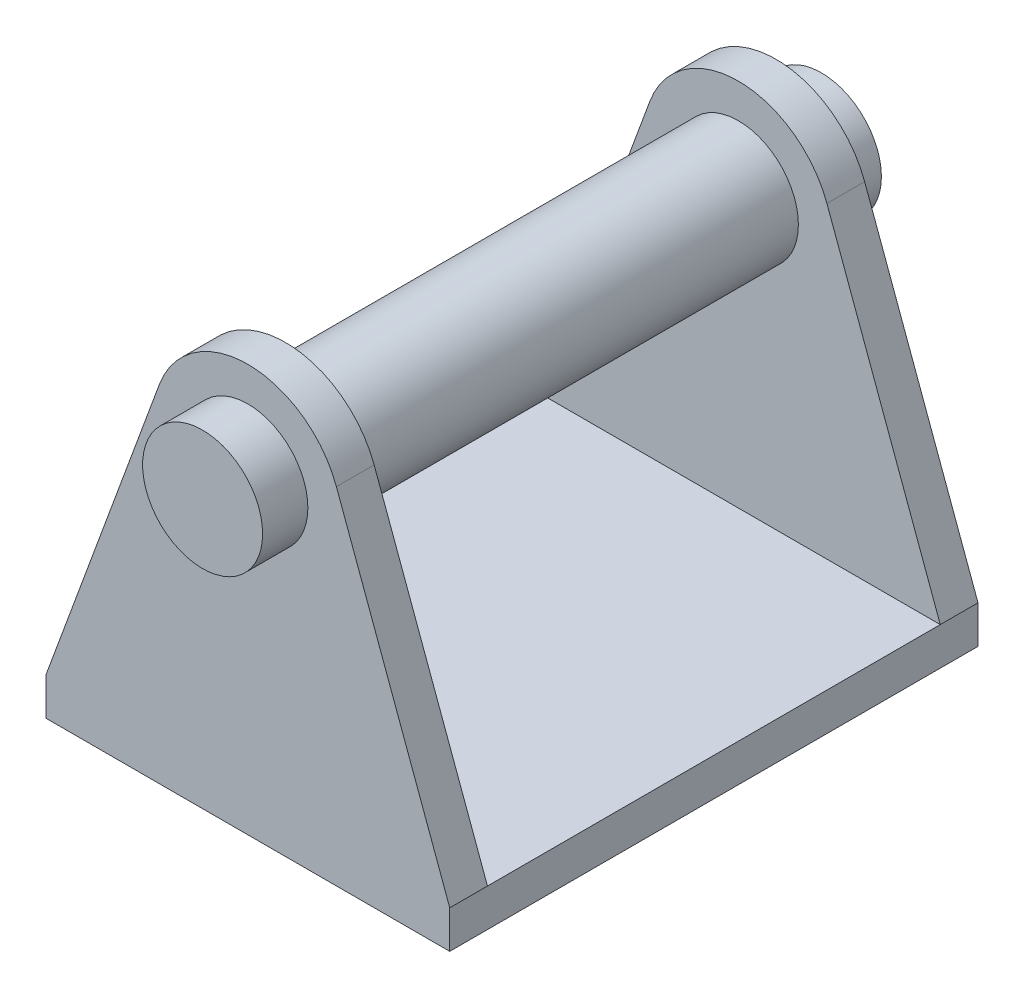
ISO-10303-21;
HEADER;
FILE_DESCRIPTION(('STEP AP214'),'2;1');
FILE_NAME('part.step','',(''),(''),'','','');
FILE_SCHEMA(('AUTOMOTIVE_DESIGN { 1 0 10303 214 1 1 1 1 }'));
ENDSEC;
DATA;
#1=APPLICATION_CONTEXT('core data for automotive mechanical design processes');
#2=APPLICATION_PROTOCOL_DEFINITION('international standard','automotive_design',2000,#1);
#3=PRODUCT_CONTEXT('',#1,'mechanical');
#4=PRODUCT('Part','Part','',(#3));
#5=PRODUCT_RELATED_PRODUCT_CATEGORY('part','',(#4));
#6=PRODUCT_DEFINITION_FORMATION('','',#4);
#7=PRODUCT_DEFINITION_CONTEXT('part definition',#1,'design');
#8=PRODUCT_DEFINITION('design','',#6,#7);
#9=PRODUCT_DEFINITION_SHAPE('','',#8);
#10=(LENGTH_UNIT() NAMED_UNIT(*) SI_UNIT(.MILLI.,.METRE.));
#11=(NAMED_UNIT(*) PLANE_ANGLE_UNIT() SI_UNIT($,.RADIAN.));
#12=(NAMED_UNIT(*) SI_UNIT($,.STERADIAN.) SOLID_ANGLE_UNIT());
#13=UNCERTAINTY_MEASURE_WITH_UNIT(LENGTH_MEASURE(1.E-05),#10,'distance_accuracy_value','');
#14=(GEOMETRIC_REPRESENTATION_CONTEXT(3) GLOBAL_UNCERTAINTY_ASSIGNED_CONTEXT((#13)) GLOBAL_UNIT_ASSIGNED_CONTEXT((#10,
#11,#12)) REPRESENTATION_CONTEXT('',''));
#15=CARTESIAN_POINT('',(0.,0.,0.));
#16=DIRECTION('',(0.,0.,1.));
#17=DIRECTION('',(1.,0.,0.));
#18=AXIS2_PLACEMENT_3D('',#15,#16,#17);
#19=CARTESIAN_POINT('',(0.,73.,-152.));
#20=DIRECTION('',(0.,0.,1.));
#21=DIRECTION('',(1.,0.,0.));
#22=AXIS2_PLACEMENT_3D('',#19,#20,#21);
#23=CYLINDRICAL_SURFACE('',#22,15.9);
#24=CARTESIAN_POINT('',(0.,73.,-130.));
#25=DIRECTION('',(0.,0.,1.));
#26=DIRECTION('',(1.,0.,0.));
#27=AXIS2_PLACEMENT_3D('',#24,#25,#26);
#28=CIRCLE('',#27,15.9);
#29=CARTESIAN_POINT('',(15.9,73.,-130.));
#30=VERTEX_POINT('',#29);
#31=EDGE_CURVE('E11',#30,#30,#28,.F.);
#32=ORIENTED_EDGE('',*,*,#31,.F.);
#33=EDGE_LOOP('',(#32));
#34=FACE_BOUND('',#33,.T.);
#35=CARTESIAN_POINT('',(0.,73.,-10.));
#36=DIRECTION('',(0.,0.,1.));
#37=DIRECTION('',(1.,0.,0.));
#38=AXIS2_PLACEMENT_3D('',#35,#36,#37);
#39=CIRCLE('',#38,15.9);
#40=CARTESIAN_POINT('',(15.9,73.,-10.));
#41=VERTEX_POINT('',#40);
#42=EDGE_CURVE('E97',#41,#41,#39,.T.);
#43=ORIENTED_EDGE('',*,*,#42,.F.);
#44=EDGE_LOOP('',(#43));
#45=FACE_BOUND('',#44,.T.);
#46=ADVANCED_FACE('F36',(#34,#45),#23,.T.);
#47=CARTESIAN_POINT('',(-53.5,0.,-10.));
#48=DIRECTION('',(-0.938482668646884,0.345326339350799,0.));
#49=DIRECTION('',(-0.345326339350799,-0.938482668646884,0.));
#50=AXIS2_PLACEMENT_3D('',#47,#48,#49);
#51=PLANE('',#50);
#52=DIRECTION('',(-0.345326339350799,-0.938482668646884,0.));
#53=VECTOR('',#52,1.);
#54=CARTESIAN_POINT('',(-53.5,0.,0.));
#55=LINE('',#54,#53);
#56=CARTESIAN_POINT('',(-23.4620667161721,81.6331584837699,0.));
#57=VERTEX_POINT('',#56);
#58=CARTESIAN_POINT('',(-53.5,0.,0.));
#59=VERTEX_POINT('',#58);
#60=EDGE_CURVE('E89',#57,#59,#55,.T.);
#61=ORIENTED_EDGE('',*,*,#60,.F.);
#62=DIRECTION('',(0.,0.,1.));
#63=VECTOR('',#62,1.);
#64=CARTESIAN_POINT('',(-23.4620667161721,81.6331584837699,-10.));
#65=LINE('',#64,#63);
#66=CARTESIAN_POINT('',(-23.4620667161721,81.6331584837699,-10.));
#67=VERTEX_POINT('',#66);
#68=EDGE_CURVE('E53',#67,#57,#65,.T.);
#69=ORIENTED_EDGE('',*,*,#68,.F.);
#70=DIRECTION('',(-0.345326339350799,-0.938482668646884,0.));
#71=VECTOR('',#70,1.);
#72=CARTESIAN_POINT('',(-53.5,0.,-10.));
#73=LINE('',#72,#71);
#74=CARTESIAN_POINT('',(-53.5,0.,-10.));
#75=VERTEX_POINT('',#74);
#76=EDGE_CURVE('E102',#67,#75,#73,.T.);
#77=ORIENTED_EDGE('',*,*,#76,.T.);
#78=DIRECTION('',(0.,0.,1.));
#79=VECTOR('',#78,1.);
#80=CARTESIAN_POINT('',(-53.5,0.,-10.));
#81=LINE('',#80,#79);
#82=EDGE_CURVE('E92',#75,#59,#81,.T.);
#83=ORIENTED_EDGE('',*,*,#82,.T.);
#84=EDGE_LOOP('',(#61,#69,#77,#83));
#85=FACE_BOUND('',#84,.T.);
#86=ADVANCED_FACE('F90',(#85),#51,.T.);
#87=CARTESIAN_POINT('',(0.,73.,-10.));
#88=DIRECTION('',(0.,0.,1.));
#89=DIRECTION('',(1.,0.,0.));
#90=AXIS2_PLACEMENT_3D('',#87,#88,#89);
#91=CYLINDRICAL_SURFACE('',#90,25.);
#92=CARTESIAN_POINT('',(0.,73.,0.));
#93=DIRECTION('',(0.,0.,1.));
#94=DIRECTION('',(1.,0.,0.));
#95=AXIS2_PLACEMENT_3D('',#92,#93,#94);
#96=CIRCLE('',#95,25.);
#97=CARTESIAN_POINT('',(23.4620667161721,81.6331584837699,0.));
#98=VERTEX_POINT('',#97);
#99=EDGE_CURVE('E83',#98,#57,#96,.T.);
#100=ORIENTED_EDGE('',*,*,#99,.F.);
#101=DIRECTION('',(0.,0.,1.));
#102=VECTOR('',#101,1.);
#103=CARTESIAN_POINT('',(23.4620667161721,81.6331584837699,-10.));
#104=LINE('',#103,#102);
#105=CARTESIAN_POINT('',(23.4620667161721,81.6331584837699,-10.));
#106=VERTEX_POINT('',#105);
#107=EDGE_CURVE('E76',#106,#98,#104,.T.);
#108=ORIENTED_EDGE('',*,*,#107,.F.);
#109=CARTESIAN_POINT('',(0.,73.,-10.));
#110=DIRECTION('',(0.,0.,1.));
#111=DIRECTION('',(1.,0.,0.));
#112=AXIS2_PLACEMENT_3D('',#109,#110,#111);
#113=CIRCLE('',#112,25.);
#114=EDGE_CURVE('E85',#106,#67,#113,.T.);
#115=ORIENTED_EDGE('',*,*,#114,.T.);
#116=ORIENTED_EDGE('',*,*,#68,.T.);
#117=EDGE_LOOP('',(#100,#108,#115,#116));
#118=FACE_BOUND('',#117,.T.);
#119=ADVANCED_FACE('F81',(#118),#91,.T.);
#120=CARTESIAN_POINT('',(53.5,0.,-10.));
#121=DIRECTION('',(0.938482668646884,0.345326339350799,0.));
#122=DIRECTION('',(-0.345326339350799,0.938482668646884,0.));
#123=AXIS2_PLACEMENT_3D('',#120,#121,#122);
#124=PLANE('',#123);
#125=DIRECTION('',(-0.345326339350799,0.938482668646884,0.));
#126=VECTOR('',#125,1.);
#127=CARTESIAN_POINT('',(53.5,0.,0.));
#128=LINE('',#127,#126);
#129=CARTESIAN_POINT('',(53.5,0.,0.));
#130=VERTEX_POINT('',#129);
#131=EDGE_CURVE('E101',#130,#98,#128,.T.);
#132=ORIENTED_EDGE('',*,*,#131,.F.);
#133=DIRECTION('',(0.,0.,1.));
#134=VECTOR('',#133,1.);
#135=CARTESIAN_POINT('',(53.5,0.,-10.));
#136=LINE('',#135,#134);
#137=CARTESIAN_POINT('',(53.5,0.,-10.));
#138=VERTEX_POINT('',#137);
#139=EDGE_CURVE('E111',#138,#130,#136,.T.);
#140=ORIENTED_EDGE('',*,*,#139,.F.);
#141=DIRECTION('',(-0.345326339350799,0.938482668646884,0.));
#142=VECTOR('',#141,1.);
#143=CARTESIAN_POINT('',(53.5,0.,-10.));
#144=LINE('',#143,#142);
#145=EDGE_CURVE('E104',#138,#106,#144,.T.);
#146=ORIENTED_EDGE('',*,*,#145,.T.);
#147=ORIENTED_EDGE('',*,*,#107,.T.);
#148=EDGE_LOOP('',(#132,#140,#146,#147));
#149=FACE_BOUND('',#148,.T.);
#150=ADVANCED_FACE('F232',(#149),#124,.T.);
#151=CARTESIAN_POINT('',(53.5,0.,-10.));
#152=DIRECTION('',(1.,0.,0.));
#153=DIRECTION('',(0.,0.,-1.));
#154=AXIS2_PLACEMENT_3D('',#151,#152,#153);
#155=PLANE('',#154);
#156=DIRECTION('',(0.,1.,0.));
#157=VECTOR('',#156,1.);
#158=CARTESIAN_POINT('',(53.5,0.,0.));
#159=LINE('',#158,#157);
#160=CARTESIAN_POINT('',(53.5,-10.,0.));
#161=VERTEX_POINT('',#160);
#162=EDGE_CURVE('E106',#161,#130,#159,.T.);
#163=ORIENTED_EDGE('',*,*,#162,.F.);
#164=DIRECTION('',(0.,0.,1.));
#165=VECTOR('',#164,1.);
#166=CARTESIAN_POINT('',(53.5,-10.,-10.));
#167=LINE('',#166,#165);
#168=CARTESIAN_POINT('',(53.5,-10.,-140.));
#169=VERTEX_POINT('',#168);
#170=EDGE_CURVE('E113',#169,#161,#167,.T.);
#171=ORIENTED_EDGE('',*,*,#170,.F.);
#172=DIRECTION('',(0.,1.,0.));
#173=VECTOR('',#172,1.);
#174=CARTESIAN_POINT('',(53.5,0.,-140.));
#175=LINE('',#174,#173);
#176=CARTESIAN_POINT('',(53.5,0.,-140.));
#177=VERTEX_POINT('',#176);
#178=EDGE_CURVE('E190',#169,#177,#175,.T.);
#179=ORIENTED_EDGE('',*,*,#178,.T.);
#180=DIRECTION('',(0.,0.,-1.));
#181=VECTOR('',#180,1.);
#182=CARTESIAN_POINT('',(53.5,0.,-130.));
#183=LINE('',#182,#181);
#184=CARTESIAN_POINT('',(53.5,0.,-130.));
#185=VERTEX_POINT('',#184);
#186=EDGE_CURVE('E209',#185,#177,#183,.T.);
#187=ORIENTED_EDGE('',*,*,#186,.F.);
#188=DIRECTION('',(0.,0.,1.));
#189=VECTOR('',#188,1.);
#190=CARTESIAN_POINT('',(53.5,0.,-10.));
#191=LINE('',#190,#189);
#192=EDGE_CURVE('E230',#185,#138,#191,.T.);
#193=ORIENTED_EDGE('',*,*,#192,.T.);
#194=ORIENTED_EDGE('',*,*,#139,.T.);
#195=EDGE_LOOP('',(#163,#171,#179,#187,#193,#194));
#196=FACE_BOUND('',#195,.T.);
#197=ADVANCED_FACE('F223',(#196),#155,.T.);
#198=CARTESIAN_POINT('',(-53.5,-10.,-10.));
#199=DIRECTION('',(0.,-1.,0.));
#200=DIRECTION('',(1.,0.,0.));
#201=AXIS2_PLACEMENT_3D('',#198,#199,#200);
#202=PLANE('',#201);
#203=DIRECTION('',(1.,0.,0.));
#204=VECTOR('',#203,1.);
#205=CARTESIAN_POINT('',(-53.5,-10.,0.));
#206=LINE('',#205,#204);
#207=CARTESIAN_POINT('',(-53.5,-10.,0.));
#208=VERTEX_POINT('',#207);
#209=EDGE_CURVE('E217',#208,#161,#206,.T.);
#210=ORIENTED_EDGE('',*,*,#209,.F.);
#211=DIRECTION('',(0.,0.,1.));
#212=VECTOR('',#211,1.);
#213=CARTESIAN_POINT('',(-53.5,-10.,-10.));
#214=LINE('',#213,#212);
#215=CARTESIAN_POINT('',(-53.5,-10.,-140.));
#216=VERTEX_POINT('',#215);
#217=EDGE_CURVE('E115',#216,#208,#214,.T.);
#218=ORIENTED_EDGE('',*,*,#217,.F.);
#219=DIRECTION('',(1.,0.,0.));
#220=VECTOR('',#219,1.);
#221=CARTESIAN_POINT('',(53.5,-10.,-140.));
#222=LINE('',#221,#220);
#223=EDGE_CURVE('E170',#216,#169,#222,.T.);
#224=ORIENTED_EDGE('',*,*,#223,.T.);
#225=ORIENTED_EDGE('',*,*,#170,.T.);
#226=EDGE_LOOP('',(#210,#218,#224,#225));
#227=FACE_BOUND('',#226,.T.);
#228=ADVANCED_FACE('F239',(#227),#202,.T.);
#229=CARTESIAN_POINT('',(-53.5,0.,-10.));
#230=DIRECTION('',(-1.,0.,0.));
#231=DIRECTION('',(0.,-1.,0.));
#232=AXIS2_PLACEMENT_3D('',#229,#230,#231);
#233=PLANE('',#232);
#234=DIRECTION('',(0.,-1.,0.));
#235=VECTOR('',#234,1.);
#236=CARTESIAN_POINT('',(-53.5,0.,0.));
#237=LINE('',#236,#235);
#238=EDGE_CURVE('E96',#59,#208,#237,.T.);
#239=ORIENTED_EDGE('',*,*,#238,.F.);
#240=ORIENTED_EDGE('',*,*,#82,.F.);
#241=DIRECTION('',(0.,0.,-1.));
#242=VECTOR('',#241,1.);
#243=CARTESIAN_POINT('',(-53.5,0.,-10.));
#244=LINE('',#243,#242);
#245=CARTESIAN_POINT('',(-53.5,0.,-130.));
#246=VERTEX_POINT('',#245);
#247=EDGE_CURVE('E167',#75,#246,#244,.T.);
#248=ORIENTED_EDGE('',*,*,#247,.T.);
#249=DIRECTION('',(0.,0.,-1.));
#250=VECTOR('',#249,1.);
#251=CARTESIAN_POINT('',(-53.5,0.,-130.));
#252=LINE('',#251,#250);
#253=CARTESIAN_POINT('',(-53.5,0.,-140.));
#254=VERTEX_POINT('',#253);
#255=EDGE_CURVE('E186',#246,#254,#252,.T.);
#256=ORIENTED_EDGE('',*,*,#255,.T.);
#257=DIRECTION('',(0.,-1.,0.));
#258=VECTOR('',#257,1.);
#259=CARTESIAN_POINT('',(-53.5,-10.,-140.));
#260=LINE('',#259,#258);
#261=EDGE_CURVE('E166',#254,#216,#260,.T.);
#262=ORIENTED_EDGE('',*,*,#261,.T.);
#263=ORIENTED_EDGE('',*,*,#217,.T.);
#264=EDGE_LOOP('',(#239,#240,#248,#256,#262,#263));
#265=FACE_BOUND('',#264,.T.);
#266=ADVANCED_FACE('F245',(#265),#233,.T.);
#267=CARTESIAN_POINT('',(0.,73.,-10.));
#268=DIRECTION('',(0.,0.,1.));
#269=DIRECTION('',(1.,0.,0.));
#270=AXIS2_PLACEMENT_3D('',#267,#268,#269);
#271=PLANE('',#270);
#272=ORIENTED_EDGE('',*,*,#42,.T.);
#273=EDGE_LOOP('',(#272));
#274=FACE_BOUND('',#273,.T.);
#275=ORIENTED_EDGE('',*,*,#145,.F.);
#276=DIRECTION('',(-1.,0.,0.));
#277=VECTOR('',#276,1.);
#278=CARTESIAN_POINT('',(-53.5,0.,-10.));
#279=LINE('',#278,#277);
#280=EDGE_CURVE('E173',#138,#75,#279,.T.);
#281=ORIENTED_EDGE('',*,*,#280,.T.);
#282=ORIENTED_EDGE('',*,*,#76,.F.);
#283=ORIENTED_EDGE('',*,*,#114,.F.);
#284=EDGE_LOOP('',(#275,#281,#282,#283));
#285=FACE_BOUND('',#284,.T.);
#286=ADVANCED_FACE('F138',(#274,#285),#271,.F.);
#287=CARTESIAN_POINT('',(0.,73.,0.));
#288=DIRECTION('',(0.,0.,1.));
#289=DIRECTION('',(1.,0.,0.));
#290=AXIS2_PLACEMENT_3D('',#287,#288,#289);
#291=PLANE('',#290);
#292=CARTESIAN_POINT('',(0.,73.,0.));
#293=DIRECTION('',(0.,0.,1.));
#294=DIRECTION('',(1.,0.,0.));
#295=AXIS2_PLACEMENT_3D('',#292,#293,#294);
#296=CIRCLE('',#295,15.9);
#297=CARTESIAN_POINT('',(15.9,73.,0.));
#298=VERTEX_POINT('',#297);
#299=EDGE_CURVE('E45',#298,#298,#296,.F.);
#300=ORIENTED_EDGE('',*,*,#299,.T.);
#301=EDGE_LOOP('',(#300));
#302=FACE_BOUND('',#301,.T.);
#303=ORIENTED_EDGE('',*,*,#60,.T.);
#304=ORIENTED_EDGE('',*,*,#238,.T.);
#305=ORIENTED_EDGE('',*,*,#209,.T.);
#306=ORIENTED_EDGE('',*,*,#162,.T.);
#307=ORIENTED_EDGE('',*,*,#131,.T.);
#308=ORIENTED_EDGE('',*,*,#99,.T.);
#309=EDGE_LOOP('',(#303,#304,#305,#306,#307,#308));
#310=FACE_BOUND('',#309,.T.);
#311=ADVANCED_FACE('F99',(#302,#310),#291,.T.);
#312=CARTESIAN_POINT('',(0.,73.,12.));
#313=DIRECTION('',(0.,0.,1.));
#314=DIRECTION('',(1.,0.,0.));
#315=AXIS2_PLACEMENT_3D('',#312,#313,#314);
#316=PLANE('',#315);
#317=CARTESIAN_POINT('',(0.,73.,12.));
#318=DIRECTION('',(0.,0.,1.));
#319=DIRECTION('',(1.,0.,0.));
#320=AXIS2_PLACEMENT_3D('',#317,#318,#319);
#321=CIRCLE('',#320,15.9);
#322=CARTESIAN_POINT('',(15.9,73.,12.));
#323=VERTEX_POINT('',#322);
#324=EDGE_CURVE('E86',#323,#323,#321,.T.);
#325=ORIENTED_EDGE('',*,*,#324,.T.);
#326=EDGE_LOOP('',(#325));
#327=FACE_BOUND('',#326,.T.);
#328=ADVANCED_FACE('F129',(#327),#316,.T.);
#329=ORIENTED_EDGE('',*,*,#299,.F.);
#330=EDGE_LOOP('',(#329));
#331=FACE_BOUND('',#330,.T.);
#332=ORIENTED_EDGE('',*,*,#324,.F.);
#333=EDGE_LOOP('',(#332));
#334=FACE_BOUND('',#333,.T.);
#335=ADVANCED_FACE('F38',(#331,#334),#23,.T.);
#336=CARTESIAN_POINT('',(0.,73.,-130.));
#337=DIRECTION('',(0.,0.,1.));
#338=DIRECTION('',(1.,0.,0.));
#339=AXIS2_PLACEMENT_3D('',#336,#337,#338);
#340=PLANE('',#339);
#341=DIRECTION('',(1.,0.,0.));
#342=VECTOR('',#341,1.);
#343=CARTESIAN_POINT('',(-53.5,0.,-130.));
#344=LINE('',#343,#342);
#345=EDGE_CURVE('E282',#246,#185,#344,.T.);
#346=ORIENTED_EDGE('',*,*,#345,.T.);
#347=DIRECTION('',(-0.345326339350799,0.938482668646884,0.));
#348=VECTOR('',#347,1.);
#349=CARTESIAN_POINT('',(23.4620667161721,81.6331584837699,-130.));
#350=LINE('',#349,#348);
#351=CARTESIAN_POINT('',(23.4620667161721,81.6331584837699,-130.));
#352=VERTEX_POINT('',#351);
#353=EDGE_CURVE('E177',#185,#352,#350,.T.);
#354=ORIENTED_EDGE('',*,*,#353,.T.);
#355=CARTESIAN_POINT('',(0.,73.,-130.));
#356=DIRECTION('',(0.,0.,1.));
#357=DIRECTION('',(1.,0.,0.));
#358=AXIS2_PLACEMENT_3D('',#355,#356,#357);
#359=CIRCLE('',#358,25.);
#360=CARTESIAN_POINT('',(-23.4620667161721,81.6331584837699,-130.));
#361=VERTEX_POINT('',#360);
#362=EDGE_CURVE('E180',#352,#361,#359,.T.);
#363=ORIENTED_EDGE('',*,*,#362,.T.);
#364=DIRECTION('',(-0.345326339350799,-0.938482668646884,0.));
#365=VECTOR('',#364,1.);
#366=CARTESIAN_POINT('',(-53.5,0.,-130.));
#367=LINE('',#366,#365);
#368=EDGE_CURVE('E184',#361,#246,#367,.T.);
#369=ORIENTED_EDGE('',*,*,#368,.T.);
#370=EDGE_LOOP('',(#346,#354,#363,#369));
#371=FACE_BOUND('',#370,.T.);
#372=ORIENTED_EDGE('',*,*,#31,.T.);
#373=EDGE_LOOP('',(#372));
#374=FACE_BOUND('',#373,.T.);
#375=ADVANCED_FACE('F128',(#371,#374),#340,.T.);
#376=CARTESIAN_POINT('',(0.,73.,-140.));
#377=DIRECTION('',(0.,0.,1.));
#378=DIRECTION('',(1.,0.,0.));
#379=AXIS2_PLACEMENT_3D('',#376,#377,#378);
#380=PLANE('',#379);
#381=ORIENTED_EDGE('',*,*,#261,.F.);
#382=DIRECTION('',(-0.345326339350799,-0.938482668646884,0.));
#383=VECTOR('',#382,1.);
#384=CARTESIAN_POINT('',(-53.5,0.,-140.));
#385=LINE('',#384,#383);
#386=CARTESIAN_POINT('',(-23.4620667161721,81.6331584837699,-140.));
#387=VERTEX_POINT('',#386);
#388=EDGE_CURVE('E181',#387,#254,#385,.T.);
#389=ORIENTED_EDGE('',*,*,#388,.F.);
#390=CARTESIAN_POINT('',(0.,73.,-140.));
#391=DIRECTION('',(0.,0.,1.));
#392=DIRECTION('',(1.,0.,0.));
#393=AXIS2_PLACEMENT_3D('',#390,#391,#392);
#394=CIRCLE('',#393,25.);
#395=CARTESIAN_POINT('',(23.4620667161721,81.6331584837699,-140.));
#396=VERTEX_POINT('',#395);
#397=EDGE_CURVE('E196',#396,#387,#394,.T.);
#398=ORIENTED_EDGE('',*,*,#397,.F.);
#399=DIRECTION('',(-0.345326339350799,0.938482668646884,0.));
#400=VECTOR('',#399,1.);
#401=CARTESIAN_POINT('',(23.4620667161721,81.6331584837699,-140.));
#402=LINE('',#401,#400);
#403=EDGE_CURVE('E193',#177,#396,#402,.T.);
#404=ORIENTED_EDGE('',*,*,#403,.F.);
#405=ORIENTED_EDGE('',*,*,#178,.F.);
#406=ORIENTED_EDGE('',*,*,#223,.F.);
#407=EDGE_LOOP('',(#381,#389,#398,#404,#405,#406));
#408=FACE_BOUND('',#407,.T.);
#409=CARTESIAN_POINT('',(0.,73.,-140.));
#410=DIRECTION('',(0.,0.,1.));
#411=DIRECTION('',(1.,0.,0.));
#412=AXIS2_PLACEMENT_3D('',#409,#410,#411);
#413=CIRCLE('',#412,15.9);
#414=CARTESIAN_POINT('',(15.9,73.,-140.));
#415=VERTEX_POINT('',#414);
#416=EDGE_CURVE('E164',#415,#415,#413,.T.);
#417=ORIENTED_EDGE('',*,*,#416,.T.);
#418=EDGE_LOOP('',(#417));
#419=FACE_BOUND('',#418,.T.);
#420=ADVANCED_FACE('F264',(#408,#419),#380,.F.);
#421=CARTESIAN_POINT('',(23.4620667161721,81.6331584837699,-130.));
#422=DIRECTION('',(-0.938482668646884,-0.345326339350799,0.));
#423=DIRECTION('',(0.345326339350799,-0.938482668646884,0.));
#424=AXIS2_PLACEMENT_3D('',#421,#422,#423);
#425=PLANE('',#424);
#426=ORIENTED_EDGE('',*,*,#403,.T.);
#427=DIRECTION('',(0.,0.,-1.));
#428=VECTOR('',#427,1.);
#429=CARTESIAN_POINT('',(23.4620667161721,81.6331584837699,-130.));
#430=LINE('',#429,#428);
#431=EDGE_CURVE('E206',#352,#396,#430,.T.);
#432=ORIENTED_EDGE('',*,*,#431,.F.);
#433=ORIENTED_EDGE('',*,*,#353,.F.);
#434=ORIENTED_EDGE('',*,*,#186,.T.);
#435=EDGE_LOOP('',(#426,#432,#433,#434));
#436=FACE_BOUND('',#435,.T.);
#437=ADVANCED_FACE('F272',(#436),#425,.F.);
#438=CARTESIAN_POINT('',(0.,73.,-130.));
#439=DIRECTION('',(0.,0.,-1.));
#440=DIRECTION('',(-1.,0.,0.));
#441=AXIS2_PLACEMENT_3D('',#438,#439,#440);
#442=CYLINDRICAL_SURFACE('',#441,25.);
#443=ORIENTED_EDGE('',*,*,#397,.T.);
#444=DIRECTION('',(0.,0.,-1.));
#445=VECTOR('',#444,1.);
#446=CARTESIAN_POINT('',(-23.4620667161721,81.6331584837699,-130.));
#447=LINE('',#446,#445);
#448=EDGE_CURVE('E203',#361,#387,#447,.T.);
#449=ORIENTED_EDGE('',*,*,#448,.F.);
#450=ORIENTED_EDGE('',*,*,#362,.F.);
#451=ORIENTED_EDGE('',*,*,#431,.T.);
#452=EDGE_LOOP('',(#443,#449,#450,#451));
#453=FACE_BOUND('',#452,.T.);
#454=ADVANCED_FACE('F294',(#453),#442,.T.);
#455=CARTESIAN_POINT('',(-53.5,0.,-130.));
#456=DIRECTION('',(0.938482668646884,-0.345326339350799,0.));
#457=DIRECTION('',(0.345326339350799,0.938482668646884,0.));
#458=AXIS2_PLACEMENT_3D('',#455,#456,#457);
#459=PLANE('',#458);
#460=ORIENTED_EDGE('',*,*,#388,.T.);
#461=ORIENTED_EDGE('',*,*,#255,.F.);
#462=ORIENTED_EDGE('',*,*,#368,.F.);
#463=ORIENTED_EDGE('',*,*,#448,.T.);
#464=EDGE_LOOP('',(#460,#461,#462,#463));
#465=FACE_BOUND('',#464,.T.);
#466=ADVANCED_FACE('F158',(#465),#459,.F.);
#467=CARTESIAN_POINT('',(0.,73.,-152.));
#468=DIRECTION('',(0.,0.,1.));
#469=DIRECTION('',(1.,0.,0.));
#470=AXIS2_PLACEMENT_3D('',#467,#468,#469);
#471=PLANE('',#470);
#472=CARTESIAN_POINT('',(0.,73.,-152.));
#473=DIRECTION('',(0.,0.,1.));
#474=DIRECTION('',(1.,0.,0.));
#475=AXIS2_PLACEMENT_3D('',#472,#473,#474);
#476=CIRCLE('',#475,15.9);
#477=CARTESIAN_POINT('',(15.9,73.,-152.));
#478=VERTEX_POINT('',#477);
#479=EDGE_CURVE('E120',#478,#478,#476,.T.);
#480=ORIENTED_EDGE('',*,*,#479,.F.);
#481=EDGE_LOOP('',(#480));
#482=FACE_BOUND('',#481,.T.);
#483=ADVANCED_FACE('F150',(#482),#471,.F.);
#484=ORIENTED_EDGE('',*,*,#479,.T.);
#485=EDGE_LOOP('',(#484));
#486=FACE_BOUND('',#485,.T.);
#487=ORIENTED_EDGE('',*,*,#416,.F.);
#488=EDGE_LOOP('',(#487));
#489=FACE_BOUND('',#488,.T.);
#490=ADVANCED_FACE('F130',(#486,#489),#23,.T.);
#491=CARTESIAN_POINT('',(0.,0.,0.));
#492=DIRECTION('',(0.,1.,0.));
#493=DIRECTION('',(-1.,0.,0.));
#494=AXIS2_PLACEMENT_3D('',#491,#492,#493);
#495=PLANE('',#494);
#496=ORIENTED_EDGE('',*,*,#345,.F.);
#497=ORIENTED_EDGE('',*,*,#247,.F.);
#498=ORIENTED_EDGE('',*,*,#280,.F.);
#499=ORIENTED_EDGE('',*,*,#192,.F.);
#500=EDGE_LOOP('',(#496,#497,#498,#499));
#501=FACE_BOUND('',#500,.T.);
#502=ADVANCED_FACE('F149',(#501),#495,.T.);
#503=CLOSED_SHELL('',(#46,#86,#119,#150,#197,#228,#266,#286,#311,#328,#335,#375,#420,#437,#454,
#466,#483,#490,#502));
#504=MANIFOLD_SOLID_BREP('B2',#503);
#505=ADVANCED_BREP_SHAPE_REPRESENTATION('',(#18,#504),#14);
#506=SHAPE_DEFINITION_REPRESENTATION(#9,#505);
ENDSEC;
END-ISO-10303-21;
